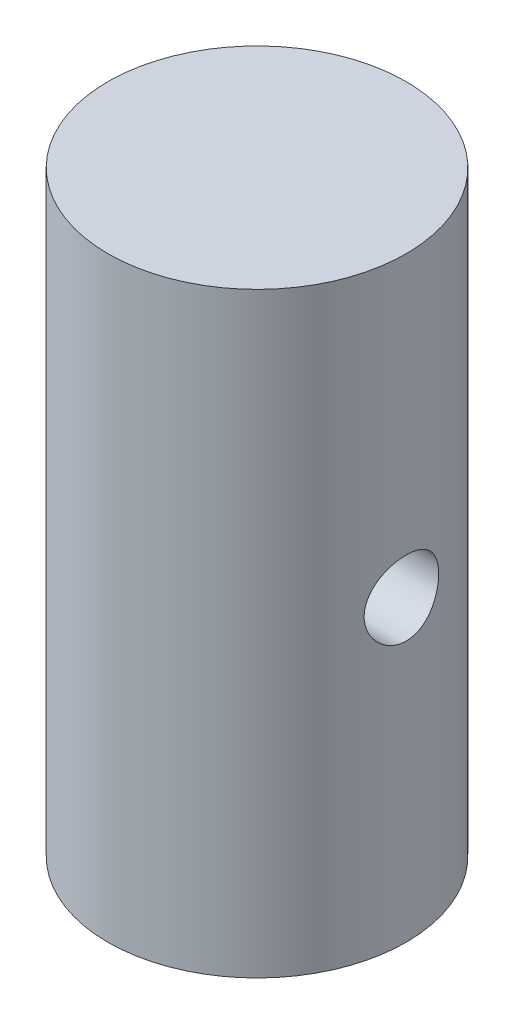
ISO-10303-21;
HEADER;
FILE_DESCRIPTION(('STEP AP214'),'2;1');
FILE_NAME('part.step','',(''),(''),'','','');
FILE_SCHEMA(('AUTOMOTIVE_DESIGN { 1 0 10303 214 1 1 1 1 }'));
ENDSEC;
DATA;
#1=APPLICATION_CONTEXT('core data for automotive mechanical design processes');
#2=APPLICATION_PROTOCOL_DEFINITION('international standard','automotive_design',2000,#1);
#3=PRODUCT_CONTEXT('',#1,'mechanical');
#4=PRODUCT('Part','Part','',(#3));
#5=PRODUCT_RELATED_PRODUCT_CATEGORY('part','',(#4));
#6=PRODUCT_DEFINITION_FORMATION('','',#4);
#7=PRODUCT_DEFINITION_CONTEXT('part definition',#1,'design');
#8=PRODUCT_DEFINITION('design','',#6,#7);
#9=PRODUCT_DEFINITION_SHAPE('','',#8);
#10=(LENGTH_UNIT() NAMED_UNIT(*) SI_UNIT(.MILLI.,.METRE.));
#11=(NAMED_UNIT(*) PLANE_ANGLE_UNIT() SI_UNIT($,.RADIAN.));
#12=(NAMED_UNIT(*) SI_UNIT($,.STERADIAN.) SOLID_ANGLE_UNIT());
#13=UNCERTAINTY_MEASURE_WITH_UNIT(LENGTH_MEASURE(1.E-05),#10,'distance_accuracy_value','');
#14=(GEOMETRIC_REPRESENTATION_CONTEXT(3) GLOBAL_UNCERTAINTY_ASSIGNED_CONTEXT((#13)) GLOBAL_UNIT_ASSIGNED_CONTEXT((#10,
#11,#12)) REPRESENTATION_CONTEXT('',''));
#15=CARTESIAN_POINT('',(0.,0.,0.));
#16=DIRECTION('',(0.,0.,1.));
#17=DIRECTION('',(1.,0.,0.));
#18=AXIS2_PLACEMENT_3D('',#15,#16,#17);
#19=CARTESIAN_POINT('',(0.,40.,0.));
#20=DIRECTION('',(0.,-1.,0.));
#21=DIRECTION('',(0.,0.,-1.));
#22=AXIS2_PLACEMENT_3D('',#19,#20,#21);
#23=CYLINDRICAL_SURFACE('',#22,10.);
#24=CARTESIAN_POINT('',(-9.68245836551855,20.,-2.5));
#25=CARTESIAN_POINT('',(-9.6824610008786,20.1380507509266,-2.49999607859307));
#26=CARTESIAN_POINT('',(-9.68544306014597,20.2761448986785,-2.48852624549765));
#27=CARTESIAN_POINT('',(-9.69701861992564,20.5483675781735,-2.44302312546379));
#28=CARTESIAN_POINT('',(-9.7056153862163,20.6824937544682,-2.4089767067421));
#29=CARTESIAN_POINT('',(-9.7273872459615,20.9428035381872,-2.31949119963204));
#30=CARTESIAN_POINT('',(-9.74055642690458,21.0689971553857,-2.26407972785449));
#31=CARTESIAN_POINT('',(-9.76998192028759,21.3103108525399,-2.13352114126138));
#32=CARTESIAN_POINT('',(-9.78623836378489,21.4254304620802,-2.05837318856068));
#33=CARTESIAN_POINT('',(-9.82040716355625,21.6438616452622,-1.88870842731188));
#34=CARTESIAN_POINT('',(-9.83834597623034,21.7468936003501,-1.79383688770405));
#35=CARTESIAN_POINT('',(-9.87362875515294,21.9357613943603,-1.58818206410066));
#36=CARTESIAN_POINT('',(-9.89097266566389,22.0215956256217,-1.4773972941803));
#37=CARTESIAN_POINT('',(-9.92340415520583,22.1747754676313,-1.24114520107895));
#38=CARTESIAN_POINT('',(-9.93845687400593,22.2418463881615,-1.11549457619512));
#39=CARTESIAN_POINT('',(-9.96430811925984,22.3538096441531,-0.85426318429276));
#40=CARTESIAN_POINT('',(-9.97510727334345,22.3987052519155,-0.718683885791938));
#41=CARTESIAN_POINT('',(-9.9910475884818,22.4641478345786,-0.444358758754159));
#42=CARTESIAN_POINT('',(-9.99629893844314,22.4851696443266,-0.305732719548973));
#43=CARTESIAN_POINT('',(-10.000935941073,22.5037583792756,-0.0268288192627671));
#44=CARTESIAN_POINT('',(-10.000322460967,22.5013287722096,0.113448794538071));
#45=CARTESIAN_POINT('',(-9.99338094953534,22.4734251497499,0.38838061793097));
#46=CARTESIAN_POINT('',(-9.98718002340871,22.4484636749461,0.52309053900267));
#47=CARTESIAN_POINT('',(-9.96990836524857,22.3770287299515,0.786345618534218));
#48=CARTESIAN_POINT('',(-9.95883737398452,22.3305541146226,0.914890448426097));
#49=CARTESIAN_POINT('',(-9.93287509700884,22.2169974293129,1.16351675875452));
#50=CARTESIAN_POINT('',(-9.91795019695011,22.1497329553383,1.28351127441626));
#51=CARTESIAN_POINT('',(-9.88589903809692,21.9966443208837,1.51068905585123));
#52=CARTESIAN_POINT('',(-9.8687723965265,21.9108169314394,1.61787008771377));
#53=CARTESIAN_POINT('',(-9.83363713769356,21.7202912580176,1.81943508771239));
#54=CARTESIAN_POINT('',(-9.81561719525297,21.6151451076523,1.91339419768799));
#55=CARTESIAN_POINT('',(-9.78115043517327,21.3904000264597,2.08244093990756));
#56=CARTESIAN_POINT('',(-9.76470369108289,21.2708004205089,2.15752769011507));
#57=CARTESIAN_POINT('',(-9.73520496829319,21.0197099658511,2.28697032255647));
#58=CARTESIAN_POINT('',(-9.72216983717007,20.8881642696872,2.34122391742613));
#59=CARTESIAN_POINT('',(-9.70118640148669,20.6174145319232,2.42671405159096));
#60=CARTESIAN_POINT('',(-9.69323700842733,20.4782121360154,2.45795551638266));
#61=CARTESIAN_POINT('',(-9.68355356007457,20.2000404984701,2.49582963866592));
#62=CARTESIAN_POINT('',(-9.68166088976934,20.061162206659,2.50309047391912));
#63=CARTESIAN_POINT('',(-9.68387343364692,19.7841780634147,2.49451699051516));
#64=CARTESIAN_POINT('',(-9.687978095703,19.6460721420506,2.4786847978498));
#65=CARTESIAN_POINT('',(-9.7015708198498,19.3768857350514,2.42492546393825));
#66=CARTESIAN_POINT('',(-9.71096970242532,19.2457272734308,2.38736406828191));
#67=CARTESIAN_POINT('',(-9.73400718262805,18.9915685421467,2.29161808167046));
#68=CARTESIAN_POINT('',(-9.74764628246408,18.8685692409442,2.2334310477125));
#69=CARTESIAN_POINT('',(-9.77796137095511,18.6315587221331,2.0967706679366));
#70=CARTESIAN_POINT('',(-9.79469168607245,18.517771159957,2.01792175383564));
#71=CARTESIAN_POINT('',(-9.82917083071113,18.3048116371985,1.84265073233613));
#72=CARTESIAN_POINT('',(-9.84691982728307,18.2056420833499,1.7462257370136));
#73=CARTESIAN_POINT('',(-9.88197403031774,18.0221889574291,1.53565680246182));
#74=CARTESIAN_POINT('',(-9.8992570206188,17.9383399374512,1.42112988132899));
#75=CARTESIAN_POINT('',(-9.9309721661369,17.7910641330487,1.17925670673669));
#76=CARTESIAN_POINT('',(-9.9454044700395,17.7276362833918,1.05191112239398));
#77=CARTESIAN_POINT('',(-9.96970115738325,17.6235539654721,0.788895504327728));
#78=CARTESIAN_POINT('',(-9.9795983002241,17.5827357156209,0.653293452569707));
#79=CARTESIAN_POINT('',(-9.99385293395789,17.5245396653916,0.376874400797019));
#80=CARTESIAN_POINT('',(-9.99821149393422,17.507157341261,0.236058412603104));
#81=CARTESIAN_POINT('',(-10.0008542352202,17.4965810260612,-0.0427088161083056));
#82=CARTESIAN_POINT('',(-9.99929947199971,17.5027457272615,-0.180634567415052));
#83=CARTESIAN_POINT('',(-9.99064741143609,17.5376195682359,-0.453418741036875));
#84=CARTESIAN_POINT('',(-9.98355027892923,17.5663280375329,-0.58827725445232));
#85=CARTESIAN_POINT('',(-9.96463582134723,17.6451305494272,-0.850427589111934));
#86=CARTESIAN_POINT('',(-9.95284411255981,17.6951086332859,-0.977756236452156));
#87=CARTESIAN_POINT('',(-9.92578222284145,17.8149264475489,-1.22229263260406));
#88=CARTESIAN_POINT('',(-9.91051160346894,17.8847686816762,-1.33949910316408));
#89=CARTESIAN_POINT('',(-9.87768124200718,18.0442880849903,-1.56350482105826));
#90=CARTESIAN_POINT('',(-9.86007542354161,18.1344003572596,-1.66998747074584));
#91=CARTESIAN_POINT('',(-9.82476622642974,18.3310571299434,-1.86653755068376));
#92=CARTESIAN_POINT('',(-9.80706282418256,18.4376057902779,-1.95660081269148));
#93=CARTESIAN_POINT('',(-9.77318689613756,18.6665035354736,-2.11940506617958));
#94=CARTESIAN_POINT('',(-9.75704909183222,18.7891103084131,-2.19179154854094));
#95=CARTESIAN_POINT('',(-9.7285988873707,19.045138724687,-2.31481724146367));
#96=CARTESIAN_POINT('',(-9.71628370583035,19.1785524152346,-2.36547227438038));
#97=CARTESIAN_POINT('',(-9.69879771876844,19.4264425295879,-2.43605632142751));
#98=CARTESIAN_POINT('',(-9.69271657508748,19.5397329109653,-2.45998292649219));
#99=CARTESIAN_POINT('',(-9.68454596456551,19.7686721724942,-2.49195573142942));
#100=CARTESIAN_POINT('',(-9.6824561572277,19.884320850611,-2.50000328592937));
#101=CARTESIAN_POINT('',(-9.68245836551855,20.,-2.5));
#102=B_SPLINE_CURVE_WITH_KNOTS('',3,(#24,#25,#26,#27,#28,#29,#30,#31,#32,#33,#34,#35,#36,#37,
#38,#39,#40,#41,#42,#43,#44,#45,#46,#47,#48,#49,#50,#51,#52,#53,#54,#55,#56,#57,#58,#59,#60,#61,
#62,#63,#64,#65,#66,#67,#68,#69,#70,#71,#72,#73,#74,#75,#76,#77,#78,#79,#80,#81,#82,#83,#84,#85,
#86,#87,#88,#89,#90,#91,#92,#93,#94,#95,#96,#97,#98,#99,#100,#101),.UNSPECIFIED.,.T.,.F.,(4,2,2,
2,2,2,2,2,2,2,2,2,2,2,2,2,2,2,2,2,2,2,2,2,2,2,2,2,2,2,2,2,2,2,2,2,2,2,4),(0.,0.413727441736139,
0.827695741428666,1.24113072716602,1.65458326755479,2.07623954192976,2.49793521479867,
2.9255149639792,3.35303159847092,3.77188750995347,4.19068148666021,4.60018262688947,
5.00970556724786,5.42292874254445,5.83622385468913,6.26070466571912,6.68520531199802,
7.11176432008402,7.53823200129548,7.95343574764204,8.36860127188747,8.77697405014152,
9.18539521426363,9.60182845864102,10.0183301888999,10.4452533097026,10.872154157245,
11.2959207281187,11.7196054891398,12.131834461324,12.5440511738193,12.9540487656466,
13.3640980574302,13.7839709658702,14.2039503157045,14.6317647729113,15.0592672137501,
15.4059782718572,15.7526597510792),.UNSPECIFIED.);
#103=CARTESIAN_POINT('',(-9.68245836551855,20.,-2.5));
#104=VERTEX_POINT('',#103);
#105=EDGE_CURVE('E37',#104,#104,#102,.T.);
#106=ORIENTED_EDGE('',*,*,#105,.T.);
#107=EDGE_LOOP('',(#106));
#108=FACE_BOUND('',#107,.T.);
#109=CARTESIAN_POINT('',(9.68245836551855,20.,-2.5));
#110=CARTESIAN_POINT('',(9.6824610008786,19.8619492490734,-2.49999607859307));
#111=CARTESIAN_POINT('',(9.68544306014597,19.7238551013215,-2.48852624549765));
#112=CARTESIAN_POINT('',(9.69701861992564,19.4516324218265,-2.44302312546379));
#113=CARTESIAN_POINT('',(9.7056153862163,19.3175062455318,-2.4089767067421));
#114=CARTESIAN_POINT('',(9.72738724596151,19.0571964618128,-2.31949119963204));
#115=CARTESIAN_POINT('',(9.74055642690458,18.9310028446143,-2.26407972785449));
#116=CARTESIAN_POINT('',(9.76998192028759,18.6896891474601,-2.13352114126138));
#117=CARTESIAN_POINT('',(9.78623836378489,18.5745695379198,-2.05837318856068));
#118=CARTESIAN_POINT('',(9.82040716355625,18.3561383547378,-1.88870842731188));
#119=CARTESIAN_POINT('',(9.83834597623034,18.25310639965,-1.79383688770405));
#120=CARTESIAN_POINT('',(9.87362875515294,18.0642386056397,-1.58818206410066));
#121=CARTESIAN_POINT('',(9.89097266566389,17.9784043743783,-1.4773972941803));
#122=CARTESIAN_POINT('',(9.92340415520583,17.8252245323687,-1.24114520107895));
#123=CARTESIAN_POINT('',(9.93845687400593,17.7581536118385,-1.11549457619512));
#124=CARTESIAN_POINT('',(9.96430811925984,17.6461903558469,-0.85426318429276));
#125=CARTESIAN_POINT('',(9.97510727334345,17.6012947480845,-0.718683885791938));
#126=CARTESIAN_POINT('',(9.9910475884818,17.5358521654214,-0.444358758754159));
#127=CARTESIAN_POINT('',(9.99629893844314,17.5148303556734,-0.305732719548973));
#128=CARTESIAN_POINT('',(10.000935941073,17.4962416207244,-0.0268288192627671));
#129=CARTESIAN_POINT('',(10.000322460967,17.4986712277904,0.113448794538071));
#130=CARTESIAN_POINT('',(9.99338094953534,17.5265748502501,0.38838061793097));
#131=CARTESIAN_POINT('',(9.98718002340871,17.5515363250539,0.52309053900267));
#132=CARTESIAN_POINT('',(9.96990836524857,17.6229712700485,0.786345618534218));
#133=CARTESIAN_POINT('',(9.95883737398452,17.6694458853774,0.914890448426097));
#134=CARTESIAN_POINT('',(9.93287509700884,17.7830025706871,1.16351675875452));
#135=CARTESIAN_POINT('',(9.91795019695011,17.8502670446617,1.28351127441626));
#136=CARTESIAN_POINT('',(9.88589903809692,18.0033556791163,1.51068905585123));
#137=CARTESIAN_POINT('',(9.8687723965265,18.0891830685606,1.61787008771377));
#138=CARTESIAN_POINT('',(9.83363713769356,18.2797087419824,1.81943508771239));
#139=CARTESIAN_POINT('',(9.81561719525297,18.3848548923477,1.91339419768799));
#140=CARTESIAN_POINT('',(9.78115043517327,18.6095999735403,2.08244093990756));
#141=CARTESIAN_POINT('',(9.76470369108289,18.7291995794911,2.15752769011507));
#142=CARTESIAN_POINT('',(9.73520496829319,18.9802900341489,2.28697032255647));
#143=CARTESIAN_POINT('',(9.72216983717007,19.1118357303128,2.34122391742613));
#144=CARTESIAN_POINT('',(9.70118640148669,19.3825854680768,2.42671405159096));
#145=CARTESIAN_POINT('',(9.69323700842733,19.5217878639846,2.45795551638266));
#146=CARTESIAN_POINT('',(9.68355356007457,19.7999595015299,2.49582963866592));
#147=CARTESIAN_POINT('',(9.68166088976934,19.938837793341,2.50309047391912));
#148=CARTESIAN_POINT('',(9.68387343364692,20.2158219365853,2.49451699051516));
#149=CARTESIAN_POINT('',(9.687978095703,20.3539278579494,2.4786847978498));
#150=CARTESIAN_POINT('',(9.7015708198498,20.6231142649486,2.42492546393825));
#151=CARTESIAN_POINT('',(9.71096970242532,20.7542727265692,2.38736406828191));
#152=CARTESIAN_POINT('',(9.73400718262805,21.0084314578533,2.29161808167046));
#153=CARTESIAN_POINT('',(9.74764628246408,21.1314307590558,2.2334310477125));
#154=CARTESIAN_POINT('',(9.77796137095511,21.3684412778669,2.0967706679366));
#155=CARTESIAN_POINT('',(9.79469168607245,21.482228840043,2.01792175383564));
#156=CARTESIAN_POINT('',(9.82917083071113,21.6951883628015,1.84265073233613));
#157=CARTESIAN_POINT('',(9.84691982728307,21.7943579166501,1.7462257370136));
#158=CARTESIAN_POINT('',(9.88197403031774,21.9778110425709,1.53565680246182));
#159=CARTESIAN_POINT('',(9.8992570206188,22.0616600625488,1.42112988132899));
#160=CARTESIAN_POINT('',(9.9309721661369,22.2089358669513,1.17925670673669));
#161=CARTESIAN_POINT('',(9.9454044700395,22.2723637166082,1.05191112239398));
#162=CARTESIAN_POINT('',(9.96970115738325,22.3764460345279,0.788895504327728));
#163=CARTESIAN_POINT('',(9.9795983002241,22.4172642843791,0.653293452569707));
#164=CARTESIAN_POINT('',(9.99385293395789,22.4754603346084,0.376874400797019));
#165=CARTESIAN_POINT('',(9.99821149393422,22.492842658739,0.236058412603104));
#166=CARTESIAN_POINT('',(10.0008542352202,22.5034189739388,-0.0427088161083056));
#167=CARTESIAN_POINT('',(9.99929947199971,22.4972542727385,-0.180634567415052));
#168=CARTESIAN_POINT('',(9.99064741143609,22.4623804317641,-0.453418741036875));
#169=CARTESIAN_POINT('',(9.98355027892923,22.4336719624671,-0.58827725445232));
#170=CARTESIAN_POINT('',(9.96463582134723,22.3548694505728,-0.850427589111933));
#171=CARTESIAN_POINT('',(9.95284411255981,22.3048913667141,-0.977756236452154));
#172=CARTESIAN_POINT('',(9.92578222284145,22.1850735524511,-1.22229263260406));
#173=CARTESIAN_POINT('',(9.91051160346894,22.1152313183238,-1.33949910316408));
#174=CARTESIAN_POINT('',(9.87768124200718,21.9557119150097,-1.56350482105826));
#175=CARTESIAN_POINT('',(9.86007542354161,21.8655996427404,-1.66998747074584));
#176=CARTESIAN_POINT('',(9.82476622642974,21.6689428700566,-1.86653755068376));
#177=CARTESIAN_POINT('',(9.80706282418256,21.5623942097221,-1.95660081269147));
#178=CARTESIAN_POINT('',(9.77318689613756,21.3334964645263,-2.11940506617958));
#179=CARTESIAN_POINT('',(9.75704909183222,21.2108896915869,-2.19179154854094));
#180=CARTESIAN_POINT('',(9.7285988873707,20.954861275313,-2.31481724146367));
#181=CARTESIAN_POINT('',(9.71628370583035,20.8214475847654,-2.36547227438038));
#182=CARTESIAN_POINT('',(9.69879771876844,20.5735574704121,-2.43605632142751));
#183=CARTESIAN_POINT('',(9.69271657508748,20.4602670890347,-2.45998292649219));
#184=CARTESIAN_POINT('',(9.68454596456551,20.2313278275058,-2.49195573142942));
#185=CARTESIAN_POINT('',(9.6824561572277,20.115679149389,-2.50000328592937));
#186=CARTESIAN_POINT('',(9.68245836551855,20.,-2.5));
#187=B_SPLINE_CURVE_WITH_KNOTS('',3,(#109,#110,#111,#112,#113,#114,#115,#116,#117,#118,#119,
#120,#121,#122,#123,#124,#125,#126,#127,#128,#129,#130,#131,#132,#133,#134,#135,#136,#137,#138,
#139,#140,#141,#142,#143,#144,#145,#146,#147,#148,#149,#150,#151,#152,#153,#154,#155,#156,#157,
#158,#159,#160,#161,#162,#163,#164,#165,#166,#167,#168,#169,#170,#171,#172,#173,#174,#175,#176,
#177,#178,#179,#180,#181,#182,#183,#184,#185,#186),.UNSPECIFIED.,.T.,.F.,(4,2,2,2,2,2,2,2,2,2,2,
2,2,2,2,2,2,2,2,2,2,2,2,2,2,2,2,2,2,2,2,2,2,2,2,2,2,2,4),(0.,0.413727441736139,
0.827695741428666,1.24113072716603,1.65458326755479,2.07623954192976,2.49793521479867,
2.9255149639792,3.35303159847092,3.77188750995347,4.19068148666021,4.60018262688947,
5.00970556724786,5.42292874254445,5.83622385468913,6.26070466571912,6.68520531199802,
7.11176432008402,7.53823200129548,7.95343574764205,8.36860127188747,8.77697405014152,
9.18539521426363,9.60182845864102,10.0183301888999,10.4452533097026,10.872154157245,
11.2959207281187,11.7196054891398,12.131834461324,12.5440511738193,12.9540487656466,
13.3640980574302,13.7839709658702,14.2039503157045,14.6317647729113,15.0592672137501,
15.4059782718572,15.7526597510792),.UNSPECIFIED.);
#188=CARTESIAN_POINT('',(9.68245836551855,20.,-2.5));
#189=VERTEX_POINT('',#188);
#190=EDGE_CURVE('E51',#189,#189,#187,.T.);
#191=ORIENTED_EDGE('',*,*,#190,.T.);
#192=EDGE_LOOP('',(#191));
#193=FACE_BOUND('',#192,.T.);
#194=CARTESIAN_POINT('',(0.,40.,0.));
#195=DIRECTION('',(0.,1.,0.));
#196=DIRECTION('',(0.,0.,1.));
#197=AXIS2_PLACEMENT_3D('',#194,#195,#196);
#198=CIRCLE('',#197,10.);
#199=CARTESIAN_POINT('',(0.,40.,10.));
#200=VERTEX_POINT('',#199);
#201=EDGE_CURVE('E10',#200,#200,#198,.T.);
#202=ORIENTED_EDGE('',*,*,#201,.F.);
#203=EDGE_LOOP('',(#202));
#204=FACE_BOUND('',#203,.T.);
#205=CARTESIAN_POINT('',(0.,0.,0.));
#206=DIRECTION('',(0.,1.,0.));
#207=DIRECTION('',(0.,0.,1.));
#208=AXIS2_PLACEMENT_3D('',#205,#206,#207);
#209=CIRCLE('',#208,10.);
#210=CARTESIAN_POINT('',(0.,0.,10.));
#211=VERTEX_POINT('',#210);
#212=EDGE_CURVE('E45',#211,#211,#209,.T.);
#213=ORIENTED_EDGE('',*,*,#212,.T.);
#214=EDGE_LOOP('',(#213));
#215=FACE_BOUND('',#214,.T.);
#216=ADVANCED_FACE('F33',(#108,#193,#204,#215),#23,.T.);
#217=CARTESIAN_POINT('',(0.,40.,0.));
#218=DIRECTION('',(0.,1.,0.));
#219=DIRECTION('',(0.,0.,1.));
#220=AXIS2_PLACEMENT_3D('',#217,#218,#219);
#221=PLANE('',#220);
#222=ORIENTED_EDGE('',*,*,#201,.T.);
#223=EDGE_LOOP('',(#222));
#224=FACE_BOUND('',#223,.T.);
#225=ADVANCED_FACE('F62',(#224),#221,.T.);
#226=CARTESIAN_POINT('',(0.,0.,0.));
#227=DIRECTION('',(0.,1.,0.));
#228=DIRECTION('',(0.,0.,1.));
#229=AXIS2_PLACEMENT_3D('',#226,#227,#228);
#230=PLANE('',#229);
#231=ORIENTED_EDGE('',*,*,#212,.F.);
#232=EDGE_LOOP('',(#231));
#233=FACE_BOUND('',#232,.T.);
#234=ADVANCED_FACE('F60',(#233),#230,.F.);
#235=CARTESIAN_POINT('',(-20.,20.,0.));
#236=DIRECTION('',(1.,0.,0.));
#237=DIRECTION('',(0.,0.,-1.));
#238=AXIS2_PLACEMENT_3D('',#235,#236,#237);
#239=CYLINDRICAL_SURFACE('',#238,2.5);
#240=ORIENTED_EDGE('',*,*,#190,.F.);
#241=EDGE_LOOP('',(#240));
#242=FACE_BOUND('',#241,.T.);
#243=ORIENTED_EDGE('',*,*,#105,.F.);
#244=EDGE_LOOP('',(#243));
#245=FACE_BOUND('',#244,.T.);
#246=ADVANCED_FACE('F56',(#242,#245),#239,.F.);
#247=CLOSED_SHELL('',(#216,#225,#234,#246));
#248=MANIFOLD_SOLID_BREP('B2',#247);
#249=ADVANCED_BREP_SHAPE_REPRESENTATION('',(#18,#248),#14);
#250=SHAPE_DEFINITION_REPRESENTATION(#9,#249);
ENDSEC;
END-ISO-10303-21;
